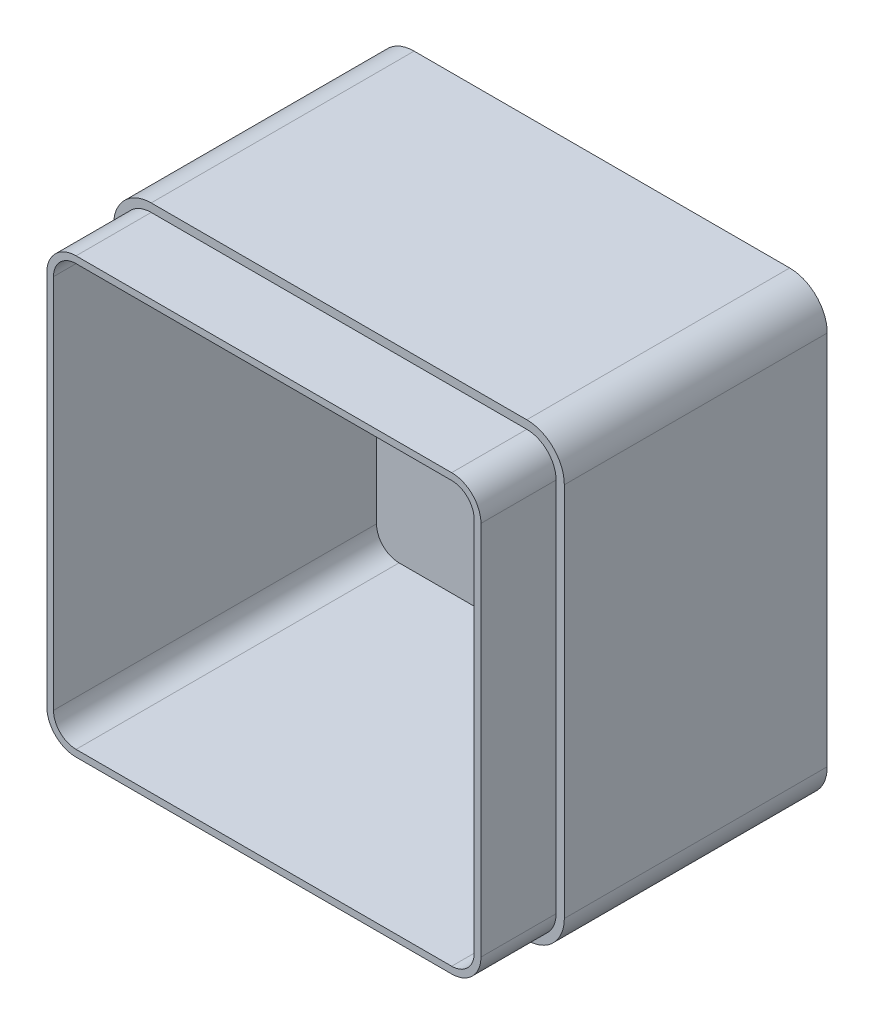
ISO-10303-21;
HEADER;
FILE_DESCRIPTION(('STEP AP214'),'2;1');
FILE_NAME('part.step','',(''),(''),'','','');
FILE_SCHEMA(('AUTOMOTIVE_DESIGN { 1 0 10303 214 1 1 1 1 }'));
ENDSEC;
DATA;
#1=APPLICATION_CONTEXT('core data for automotive mechanical design processes');
#2=APPLICATION_PROTOCOL_DEFINITION('international standard','automotive_design',2000,#1);
#3=PRODUCT_CONTEXT('',#1,'mechanical');
#4=PRODUCT('Part','Part','',(#3));
#5=PRODUCT_RELATED_PRODUCT_CATEGORY('part','',(#4));
#6=PRODUCT_DEFINITION_FORMATION('','',#4);
#7=PRODUCT_DEFINITION_CONTEXT('part definition',#1,'design');
#8=PRODUCT_DEFINITION('design','',#6,#7);
#9=PRODUCT_DEFINITION_SHAPE('','',#8);
#10=(LENGTH_UNIT() NAMED_UNIT(*) SI_UNIT(.MILLI.,.METRE.));
#11=(NAMED_UNIT(*) PLANE_ANGLE_UNIT() SI_UNIT($,.RADIAN.));
#12=(NAMED_UNIT(*) SI_UNIT($,.STERADIAN.) SOLID_ANGLE_UNIT());
#13=UNCERTAINTY_MEASURE_WITH_UNIT(LENGTH_MEASURE(1.E-05),#10,'distance_accuracy_value','');
#14=(GEOMETRIC_REPRESENTATION_CONTEXT(3) GLOBAL_UNCERTAINTY_ASSIGNED_CONTEXT((#13)) GLOBAL_UNIT_ASSIGNED_CONTEXT((#10,
#11,#12)) REPRESENTATION_CONTEXT('',''));
#15=CARTESIAN_POINT('',(0.,0.,0.));
#16=DIRECTION('',(0.,0.,1.));
#17=DIRECTION('',(1.,0.,0.));
#18=AXIS2_PLACEMENT_3D('',#15,#16,#17);
#19=CARTESIAN_POINT('',(0.,0.,90.));
#20=DIRECTION('',(0.,0.,-1.));
#21=DIRECTION('',(-1.,0.,0.));
#22=AXIS2_PLACEMENT_3D('',#19,#20,#21);
#23=PLANE('',#22);
#24=DIRECTION('',(0.,-1.,0.));
#25=VECTOR('',#24,1.);
#26=CARTESIAN_POINT('',(4.,0.,90.));
#27=LINE('',#26,#25);
#28=CARTESIAN_POINT('',(4.,110.,90.));
#29=VERTEX_POINT('',#28);
#30=CARTESIAN_POINT('',(4.,9.99999999999999,90.));
#31=VERTEX_POINT('',#30);
#32=EDGE_CURVE('E323',#29,#31,#27,.T.);
#33=ORIENTED_EDGE('',*,*,#32,.F.);
#34=CARTESIAN_POINT('',(10.,110.,90.));
#35=DIRECTION('',(0.,0.,-1.));
#36=DIRECTION('',(-1.,0.,0.));
#37=AXIS2_PLACEMENT_3D('',#34,#35,#36);
#38=CIRCLE('',#37,6.);
#39=CARTESIAN_POINT('',(9.99999999999999,116.,90.));
#40=VERTEX_POINT('',#39);
#41=EDGE_CURVE('E306',#40,#29,#38,.F.);
#42=ORIENTED_EDGE('',*,*,#41,.F.);
#43=DIRECTION('',(-1.,0.,0.));
#44=VECTOR('',#43,1.);
#45=CARTESIAN_POINT('',(0.,116.,90.));
#46=LINE('',#45,#44);
#47=CARTESIAN_POINT('',(110.,116.,90.));
#48=VERTEX_POINT('',#47);
#49=EDGE_CURVE('E332',#48,#40,#46,.T.);
#50=ORIENTED_EDGE('',*,*,#49,.F.);
#51=CARTESIAN_POINT('',(110.,110.,90.));
#52=DIRECTION('',(0.,0.,-1.));
#53=DIRECTION('',(-1.,0.,0.));
#54=AXIS2_PLACEMENT_3D('',#51,#52,#53);
#55=CIRCLE('',#54,6.);
#56=CARTESIAN_POINT('',(116.,110.,90.));
#57=VERTEX_POINT('',#56);
#58=EDGE_CURVE('E355',#57,#48,#55,.F.);
#59=ORIENTED_EDGE('',*,*,#58,.F.);
#60=DIRECTION('',(0.,1.,0.));
#61=VECTOR('',#60,1.);
#62=CARTESIAN_POINT('',(116.,0.,90.));
#63=LINE('',#62,#61);
#64=CARTESIAN_POINT('',(116.,9.99999999999999,90.));
#65=VERTEX_POINT('',#64);
#66=EDGE_CURVE('E353',#65,#57,#63,.T.);
#67=ORIENTED_EDGE('',*,*,#66,.F.);
#68=CARTESIAN_POINT('',(110.,10.,90.));
#69=DIRECTION('',(0.,0.,-1.));
#70=DIRECTION('',(-1.,0.,0.));
#71=AXIS2_PLACEMENT_3D('',#68,#69,#70);
#72=CIRCLE('',#71,6.);
#73=CARTESIAN_POINT('',(110.,4.,90.));
#74=VERTEX_POINT('',#73);
#75=EDGE_CURVE('E350',#74,#65,#72,.F.);
#76=ORIENTED_EDGE('',*,*,#75,.F.);
#77=DIRECTION('',(1.,0.,0.));
#78=VECTOR('',#77,1.);
#79=CARTESIAN_POINT('',(0.,4.,90.));
#80=LINE('',#79,#78);
#81=CARTESIAN_POINT('',(9.99999999999999,4.,90.));
#82=VERTEX_POINT('',#81);
#83=EDGE_CURVE('E348',#82,#74,#80,.T.);
#84=ORIENTED_EDGE('',*,*,#83,.F.);
#85=CARTESIAN_POINT('',(10.,10.,90.));
#86=DIRECTION('',(0.,0.,-1.));
#87=DIRECTION('',(-1.,0.,0.));
#88=AXIS2_PLACEMENT_3D('',#85,#86,#87);
#89=CIRCLE('',#88,6.);
#90=EDGE_CURVE('E339',#31,#82,#89,.F.);
#91=ORIENTED_EDGE('',*,*,#90,.F.);
#92=EDGE_LOOP('',(#33,#42,#50,#59,#67,#76,#84,#91));
#93=FACE_BOUND('',#92,.T.);
#94=CARTESIAN_POINT('',(10.,110.,90.));
#95=DIRECTION('',(0.,0.,1.));
#96=DIRECTION('',(1.,0.,0.));
#97=AXIS2_PLACEMENT_3D('',#94,#95,#96);
#98=CIRCLE('',#97,7.79999999999999);
#99=CARTESIAN_POINT('',(9.99999999999999,117.8,90.));
#100=VERTEX_POINT('',#99);
#101=CARTESIAN_POINT('',(2.2,110.,90.));
#102=VERTEX_POINT('',#101);
#103=EDGE_CURVE('E258',#100,#102,#98,.T.);
#104=ORIENTED_EDGE('',*,*,#103,.T.);
#105=DIRECTION('',(0.,-1.,0.));
#106=VECTOR('',#105,1.);
#107=CARTESIAN_POINT('',(2.2,110.,90.));
#108=LINE('',#107,#106);
#109=CARTESIAN_POINT('',(2.20000000000001,9.99999999999999,90.));
#110=VERTEX_POINT('',#109);
#111=EDGE_CURVE('E218',#102,#110,#108,.T.);
#112=ORIENTED_EDGE('',*,*,#111,.T.);
#113=CARTESIAN_POINT('',(10.,10.,90.));
#114=DIRECTION('',(0.,0.,1.));
#115=DIRECTION('',(1.,0.,0.));
#116=AXIS2_PLACEMENT_3D('',#113,#114,#115);
#117=CIRCLE('',#116,7.79999999999999);
#118=CARTESIAN_POINT('',(9.99999999999999,2.20000000000001,90.));
#119=VERTEX_POINT('',#118);
#120=EDGE_CURVE('E67',#110,#119,#117,.T.);
#121=ORIENTED_EDGE('',*,*,#120,.T.);
#122=DIRECTION('',(1.,0.,0.));
#123=VECTOR('',#122,1.);
#124=CARTESIAN_POINT('',(9.99999999999999,2.2,90.));
#125=LINE('',#124,#123);
#126=CARTESIAN_POINT('',(110.,2.2,90.));
#127=VERTEX_POINT('',#126);
#128=EDGE_CURVE('E262',#119,#127,#125,.T.);
#129=ORIENTED_EDGE('',*,*,#128,.T.);
#130=CARTESIAN_POINT('',(110.,10.,90.));
#131=DIRECTION('',(0.,0.,1.));
#132=DIRECTION('',(1.,0.,0.));
#133=AXIS2_PLACEMENT_3D('',#130,#131,#132);
#134=CIRCLE('',#133,7.79999999999999);
#135=CARTESIAN_POINT('',(117.8,10.,90.));
#136=VERTEX_POINT('',#135);
#137=EDGE_CURVE('E265',#127,#136,#134,.T.);
#138=ORIENTED_EDGE('',*,*,#137,.T.);
#139=DIRECTION('',(0.,1.,0.));
#140=VECTOR('',#139,1.);
#141=CARTESIAN_POINT('',(117.8,9.99999999999999,90.));
#142=LINE('',#141,#140);
#143=CARTESIAN_POINT('',(117.8,110.,90.));
#144=VERTEX_POINT('',#143);
#145=EDGE_CURVE('E268',#136,#144,#142,.T.);
#146=ORIENTED_EDGE('',*,*,#145,.T.);
#147=CARTESIAN_POINT('',(110.,110.,90.));
#148=DIRECTION('',(0.,0.,1.));
#149=DIRECTION('',(1.,0.,0.));
#150=AXIS2_PLACEMENT_3D('',#147,#148,#149);
#151=CIRCLE('',#150,7.8);
#152=CARTESIAN_POINT('',(110.,117.8,90.));
#153=VERTEX_POINT('',#152);
#154=EDGE_CURVE('E241',#144,#153,#151,.T.);
#155=ORIENTED_EDGE('',*,*,#154,.T.);
#156=DIRECTION('',(-1.,0.,0.));
#157=VECTOR('',#156,1.);
#158=CARTESIAN_POINT('',(110.,117.8,90.));
#159=LINE('',#158,#157);
#160=EDGE_CURVE('E238',#153,#100,#159,.T.);
#161=ORIENTED_EDGE('',*,*,#160,.T.);
#162=EDGE_LOOP('',(#104,#112,#121,#129,#138,#146,#155,#161));
#163=FACE_BOUND('',#162,.T.);
#164=ADVANCED_FACE('F52',(#93,#163),#23,.F.);
#165=CARTESIAN_POINT('',(4.,0.,90.));
#166=DIRECTION('',(1.,0.,0.));
#167=DIRECTION('',(0.,0.,-1.));
#168=AXIS2_PLACEMENT_3D('',#165,#166,#167);
#169=PLANE('',#168);
#170=DIRECTION('',(0.,-1.,0.));
#171=VECTOR('',#170,1.);
#172=CARTESIAN_POINT('',(4.,0.,4.));
#173=LINE('',#172,#171);
#174=CARTESIAN_POINT('',(4.,110.,4.));
#175=VERTEX_POINT('',#174);
#176=CARTESIAN_POINT('',(4.,9.99999999999999,4.));
#177=VERTEX_POINT('',#176);
#178=EDGE_CURVE('E300',#175,#177,#173,.T.);
#179=ORIENTED_EDGE('',*,*,#178,.F.);
#180=DIRECTION('',(0.,0.,-1.));
#181=VECTOR('',#180,1.);
#182=CARTESIAN_POINT('',(4.,110.,90.));
#183=LINE('',#182,#181);
#184=EDGE_CURVE('E307',#29,#175,#183,.T.);
#185=ORIENTED_EDGE('',*,*,#184,.F.);
#186=ORIENTED_EDGE('',*,*,#32,.T.);
#187=DIRECTION('',(0.,0.,-1.));
#188=VECTOR('',#187,1.);
#189=CARTESIAN_POINT('',(4.,9.99999999999999,90.));
#190=LINE('',#189,#188);
#191=EDGE_CURVE('E304',#177,#31,#190,.F.);
#192=ORIENTED_EDGE('',*,*,#191,.F.);
#193=EDGE_LOOP('',(#179,#185,#186,#192));
#194=FACE_BOUND('',#193,.T.);
#195=ADVANCED_FACE('F446',(#194),#169,.T.);
#196=CARTESIAN_POINT('',(0.,4.,90.));
#197=DIRECTION('',(0.,1.,0.));
#198=DIRECTION('',(0.,0.,1.));
#199=AXIS2_PLACEMENT_3D('',#196,#197,#198);
#200=PLANE('',#199);
#201=ORIENTED_EDGE('',*,*,#83,.T.);
#202=DIRECTION('',(0.,0.,1.));
#203=VECTOR('',#202,1.);
#204=CARTESIAN_POINT('',(110.,4.,90.));
#205=LINE('',#204,#203);
#206=CARTESIAN_POINT('',(110.,4.,4.));
#207=VERTEX_POINT('',#206);
#208=EDGE_CURVE('E330',#207,#74,#205,.T.);
#209=ORIENTED_EDGE('',*,*,#208,.F.);
#210=DIRECTION('',(1.,0.,0.));
#211=VECTOR('',#210,1.);
#212=CARTESIAN_POINT('',(0.,4.,4.));
#213=LINE('',#212,#211);
#214=CARTESIAN_POINT('',(9.99999999999999,4.,4.));
#215=VERTEX_POINT('',#214);
#216=EDGE_CURVE('E303',#215,#207,#213,.T.);
#217=ORIENTED_EDGE('',*,*,#216,.F.);
#218=DIRECTION('',(0.,0.,1.));
#219=VECTOR('',#218,1.);
#220=CARTESIAN_POINT('',(9.99999999999999,4.,90.));
#221=LINE('',#220,#219);
#222=EDGE_CURVE('E319',#82,#215,#221,.F.);
#223=ORIENTED_EDGE('',*,*,#222,.F.);
#224=EDGE_LOOP('',(#201,#209,#217,#223));
#225=FACE_BOUND('',#224,.T.);
#226=ADVANCED_FACE('F452',(#225),#200,.T.);
#227=CARTESIAN_POINT('',(116.,0.,90.));
#228=DIRECTION('',(-1.,0.,0.));
#229=DIRECTION('',(0.,0.,1.));
#230=AXIS2_PLACEMENT_3D('',#227,#228,#229);
#231=PLANE('',#230);
#232=ORIENTED_EDGE('',*,*,#66,.T.);
#233=DIRECTION('',(0.,0.,1.));
#234=VECTOR('',#233,1.);
#235=CARTESIAN_POINT('',(116.,110.,90.));
#236=LINE('',#235,#234);
#237=CARTESIAN_POINT('',(116.,110.,4.));
#238=VERTEX_POINT('',#237);
#239=EDGE_CURVE('E337',#238,#57,#236,.T.);
#240=ORIENTED_EDGE('',*,*,#239,.F.);
#241=DIRECTION('',(0.,1.,0.));
#242=VECTOR('',#241,1.);
#243=CARTESIAN_POINT('',(116.,0.,4.));
#244=LINE('',#243,#242);
#245=CARTESIAN_POINT('',(116.,9.99999999999999,4.));
#246=VERTEX_POINT('',#245);
#247=EDGE_CURVE('E313',#246,#238,#244,.T.);
#248=ORIENTED_EDGE('',*,*,#247,.F.);
#249=DIRECTION('',(0.,0.,1.));
#250=VECTOR('',#249,1.);
#251=CARTESIAN_POINT('',(116.,9.99999999999999,90.));
#252=LINE('',#251,#250);
#253=EDGE_CURVE('E333',#65,#246,#252,.F.);
#254=ORIENTED_EDGE('',*,*,#253,.F.);
#255=EDGE_LOOP('',(#232,#240,#248,#254));
#256=FACE_BOUND('',#255,.T.);
#257=ADVANCED_FACE('F480',(#256),#231,.T.);
#258=CARTESIAN_POINT('',(0.,116.,90.));
#259=DIRECTION('',(0.,-1.,0.));
#260=DIRECTION('',(0.,0.,-1.));
#261=AXIS2_PLACEMENT_3D('',#258,#259,#260);
#262=PLANE('',#261);
#263=ORIENTED_EDGE('',*,*,#49,.T.);
#264=DIRECTION('',(0.,0.,-1.));
#265=VECTOR('',#264,1.);
#266=CARTESIAN_POINT('',(9.99999999999999,116.,90.));
#267=LINE('',#266,#265);
#268=CARTESIAN_POINT('',(9.99999999999999,116.,4.));
#269=VERTEX_POINT('',#268);
#270=EDGE_CURVE('E336',#269,#40,#267,.F.);
#271=ORIENTED_EDGE('',*,*,#270,.F.);
#272=DIRECTION('',(-1.,0.,0.));
#273=VECTOR('',#272,1.);
#274=CARTESIAN_POINT('',(0.,116.,4.));
#275=LINE('',#274,#273);
#276=CARTESIAN_POINT('',(110.,116.,4.));
#277=VERTEX_POINT('',#276);
#278=EDGE_CURVE('E320',#277,#269,#275,.T.);
#279=ORIENTED_EDGE('',*,*,#278,.F.);
#280=DIRECTION('',(0.,0.,-1.));
#281=VECTOR('',#280,1.);
#282=CARTESIAN_POINT('',(110.,116.,90.));
#283=LINE('',#282,#281);
#284=EDGE_CURVE('E340',#48,#277,#283,.T.);
#285=ORIENTED_EDGE('',*,*,#284,.F.);
#286=EDGE_LOOP('',(#263,#271,#279,#285));
#287=FACE_BOUND('',#286,.T.);
#288=ADVANCED_FACE('F476',(#287),#262,.T.);
#289=CARTESIAN_POINT('',(0.,0.,4.));
#290=DIRECTION('',(0.,0.,-1.));
#291=DIRECTION('',(-1.,0.,0.));
#292=AXIS2_PLACEMENT_3D('',#289,#290,#291);
#293=PLANE('',#292);
#294=ORIENTED_EDGE('',*,*,#216,.T.);
#295=CARTESIAN_POINT('',(110.,10.,4.));
#296=DIRECTION('',(0.,0.,-1.));
#297=DIRECTION('',(-1.,0.,0.));
#298=AXIS2_PLACEMENT_3D('',#295,#296,#297);
#299=CIRCLE('',#298,6.);
#300=EDGE_CURVE('E315',#246,#207,#299,.T.);
#301=ORIENTED_EDGE('',*,*,#300,.F.);
#302=ORIENTED_EDGE('',*,*,#247,.T.);
#303=CARTESIAN_POINT('',(110.,110.,4.));
#304=DIRECTION('',(0.,0.,-1.));
#305=DIRECTION('',(-1.,0.,0.));
#306=AXIS2_PLACEMENT_3D('',#303,#304,#305);
#307=CIRCLE('',#306,6.);
#308=EDGE_CURVE('E318',#277,#238,#307,.T.);
#309=ORIENTED_EDGE('',*,*,#308,.F.);
#310=ORIENTED_EDGE('',*,*,#278,.T.);
#311=CARTESIAN_POINT('',(10.,110.,4.));
#312=DIRECTION('',(0.,0.,-1.));
#313=DIRECTION('',(-1.,0.,0.));
#314=AXIS2_PLACEMENT_3D('',#311,#312,#313);
#315=CIRCLE('',#314,6.);
#316=EDGE_CURVE('E316',#175,#269,#315,.T.);
#317=ORIENTED_EDGE('',*,*,#316,.F.);
#318=ORIENTED_EDGE('',*,*,#178,.T.);
#319=CARTESIAN_POINT('',(10.,10.,4.));
#320=DIRECTION('',(0.,0.,-1.));
#321=DIRECTION('',(-1.,0.,0.));
#322=AXIS2_PLACEMENT_3D('',#319,#320,#321);
#323=CIRCLE('',#322,6.);
#324=EDGE_CURVE('E310',#215,#177,#323,.T.);
#325=ORIENTED_EDGE('',*,*,#324,.F.);
#326=EDGE_LOOP('',(#294,#301,#302,#309,#310,#317,#318,#325));
#327=FACE_BOUND('',#326,.T.);
#328=ADVANCED_FACE('F472',(#327),#293,.F.);
#329=CARTESIAN_POINT('',(10.,10.,90.));
#330=DIRECTION('',(0.,0.,-1.));
#331=DIRECTION('',(-1.,0.,0.));
#332=AXIS2_PLACEMENT_3D('',#329,#330,#331);
#333=CYLINDRICAL_SURFACE('',#332,6.);
#334=ORIENTED_EDGE('',*,*,#90,.T.);
#335=ORIENTED_EDGE('',*,*,#222,.T.);
#336=ORIENTED_EDGE('',*,*,#324,.T.);
#337=ORIENTED_EDGE('',*,*,#191,.T.);
#338=EDGE_LOOP('',(#334,#335,#336,#337));
#339=FACE_BOUND('',#338,.T.);
#340=ADVANCED_FACE('F468',(#339),#333,.F.);
#341=CARTESIAN_POINT('',(110.,10.,90.));
#342=DIRECTION('',(0.,0.,-1.));
#343=DIRECTION('',(-1.,0.,0.));
#344=AXIS2_PLACEMENT_3D('',#341,#342,#343);
#345=CYLINDRICAL_SURFACE('',#344,6.);
#346=ORIENTED_EDGE('',*,*,#75,.T.);
#347=ORIENTED_EDGE('',*,*,#253,.T.);
#348=ORIENTED_EDGE('',*,*,#300,.T.);
#349=ORIENTED_EDGE('',*,*,#208,.T.);
#350=EDGE_LOOP('',(#346,#347,#348,#349));
#351=FACE_BOUND('',#350,.T.);
#352=ADVANCED_FACE('F464',(#351),#345,.F.);
#353=CARTESIAN_POINT('',(110.,110.,90.));
#354=DIRECTION('',(0.,0.,-1.));
#355=DIRECTION('',(-1.,0.,0.));
#356=AXIS2_PLACEMENT_3D('',#353,#354,#355);
#357=CYLINDRICAL_SURFACE('',#356,6.);
#358=ORIENTED_EDGE('',*,*,#58,.T.);
#359=ORIENTED_EDGE('',*,*,#284,.T.);
#360=ORIENTED_EDGE('',*,*,#308,.T.);
#361=ORIENTED_EDGE('',*,*,#239,.T.);
#362=EDGE_LOOP('',(#358,#359,#360,#361));
#363=FACE_BOUND('',#362,.T.);
#364=ADVANCED_FACE('F460',(#363),#357,.F.);
#365=CARTESIAN_POINT('',(10.,110.,90.));
#366=DIRECTION('',(0.,0.,-1.));
#367=DIRECTION('',(-1.,0.,0.));
#368=AXIS2_PLACEMENT_3D('',#365,#366,#367);
#369=CYLINDRICAL_SURFACE('',#368,6.);
#370=ORIENTED_EDGE('',*,*,#41,.T.);
#371=ORIENTED_EDGE('',*,*,#184,.T.);
#372=ORIENTED_EDGE('',*,*,#316,.T.);
#373=ORIENTED_EDGE('',*,*,#270,.T.);
#374=EDGE_LOOP('',(#370,#371,#372,#373));
#375=FACE_BOUND('',#374,.T.);
#376=ADVANCED_FACE('F458',(#375),#369,.F.);
#377=CARTESIAN_POINT('',(10.,110.,70.));
#378=DIRECTION('',(0.,0.,1.));
#379=DIRECTION('',(1.,0.,0.));
#380=AXIS2_PLACEMENT_3D('',#377,#378,#379);
#381=PLANE('',#380);
#382=DIRECTION('',(-1.,0.,0.));
#383=VECTOR('',#382,1.);
#384=CARTESIAN_POINT('',(110.,117.8,70.));
#385=LINE('',#384,#383);
#386=CARTESIAN_POINT('',(110.,117.8,70.));
#387=VERTEX_POINT('',#386);
#388=CARTESIAN_POINT('',(9.99999999999999,117.8,70.));
#389=VERTEX_POINT('',#388);
#390=EDGE_CURVE('E224',#387,#389,#385,.T.);
#391=ORIENTED_EDGE('',*,*,#390,.F.);
#392=CARTESIAN_POINT('',(110.,110.,70.));
#393=DIRECTION('',(0.,0.,1.));
#394=DIRECTION('',(1.,0.,0.));
#395=AXIS2_PLACEMENT_3D('',#392,#393,#394);
#396=CIRCLE('',#395,7.8);
#397=CARTESIAN_POINT('',(117.8,110.,70.));
#398=VERTEX_POINT('',#397);
#399=EDGE_CURVE('E254',#398,#387,#396,.T.);
#400=ORIENTED_EDGE('',*,*,#399,.F.);
#401=DIRECTION('',(0.,1.,0.));
#402=VECTOR('',#401,1.);
#403=CARTESIAN_POINT('',(117.8,9.99999999999999,70.));
#404=LINE('',#403,#402);
#405=CARTESIAN_POINT('',(117.8,10.,70.));
#406=VERTEX_POINT('',#405);
#407=EDGE_CURVE('E251',#406,#398,#404,.T.);
#408=ORIENTED_EDGE('',*,*,#407,.F.);
#409=CARTESIAN_POINT('',(110.,10.,70.));
#410=DIRECTION('',(0.,0.,1.));
#411=DIRECTION('',(1.,0.,0.));
#412=AXIS2_PLACEMENT_3D('',#409,#410,#411);
#413=CIRCLE('',#412,7.79999999999999);
#414=CARTESIAN_POINT('',(110.,2.2,70.));
#415=VERTEX_POINT('',#414);
#416=EDGE_CURVE('E248',#415,#406,#413,.T.);
#417=ORIENTED_EDGE('',*,*,#416,.F.);
#418=DIRECTION('',(1.,0.,0.));
#419=VECTOR('',#418,1.);
#420=CARTESIAN_POINT('',(9.99999999999999,2.2,70.));
#421=LINE('',#420,#419);
#422=CARTESIAN_POINT('',(9.99999999999999,2.20000000000001,70.));
#423=VERTEX_POINT('',#422);
#424=EDGE_CURVE('E245',#423,#415,#421,.T.);
#425=ORIENTED_EDGE('',*,*,#424,.F.);
#426=CARTESIAN_POINT('',(10.,10.,70.));
#427=DIRECTION('',(0.,0.,1.));
#428=DIRECTION('',(1.,0.,0.));
#429=AXIS2_PLACEMENT_3D('',#426,#427,#428);
#430=CIRCLE('',#429,7.79999999999999);
#431=CARTESIAN_POINT('',(2.20000000000001,9.99999999999999,70.));
#432=VERTEX_POINT('',#431);
#433=EDGE_CURVE('E234',#432,#423,#430,.T.);
#434=ORIENTED_EDGE('',*,*,#433,.F.);
#435=DIRECTION('',(0.,-1.,0.));
#436=VECTOR('',#435,1.);
#437=CARTESIAN_POINT('',(2.2,110.,70.));
#438=LINE('',#437,#436);
#439=CARTESIAN_POINT('',(2.2,110.,70.));
#440=VERTEX_POINT('',#439);
#441=EDGE_CURVE('E216',#440,#432,#438,.T.);
#442=ORIENTED_EDGE('',*,*,#441,.F.);
#443=CARTESIAN_POINT('',(10.,110.,70.));
#444=DIRECTION('',(0.,0.,1.));
#445=DIRECTION('',(1.,0.,0.));
#446=AXIS2_PLACEMENT_3D('',#443,#444,#445);
#447=CIRCLE('',#446,7.79999999999999);
#448=EDGE_CURVE('E230',#389,#440,#447,.T.);
#449=ORIENTED_EDGE('',*,*,#448,.F.);
#450=EDGE_LOOP('',(#391,#400,#408,#417,#425,#434,#442,#449));
#451=FACE_BOUND('',#450,.T.);
#452=CARTESIAN_POINT('',(10.,110.,70.));
#453=DIRECTION('',(0.,0.,1.));
#454=DIRECTION('',(1.,0.,0.));
#455=AXIS2_PLACEMENT_3D('',#452,#453,#454);
#456=CIRCLE('',#455,10.);
#457=CARTESIAN_POINT('',(10.,120.,70.));
#458=VERTEX_POINT('',#457);
#459=CARTESIAN_POINT('',(0.,110.,70.));
#460=VERTEX_POINT('',#459);
#461=EDGE_CURVE('E274',#458,#460,#456,.T.);
#462=ORIENTED_EDGE('',*,*,#461,.T.);
#463=DIRECTION('',(0.,-1.,0.));
#464=VECTOR('',#463,1.);
#465=CARTESIAN_POINT('',(0.,110.,70.));
#466=LINE('',#465,#464);
#467=CARTESIAN_POINT('',(0.,9.99999999999999,70.));
#468=VERTEX_POINT('',#467);
#469=EDGE_CURVE('E287',#460,#468,#466,.T.);
#470=ORIENTED_EDGE('',*,*,#469,.T.);
#471=CARTESIAN_POINT('',(10.,10.,70.));
#472=DIRECTION('',(0.,0.,1.));
#473=DIRECTION('',(1.,0.,0.));
#474=AXIS2_PLACEMENT_3D('',#471,#472,#473);
#475=CIRCLE('',#474,10.);
#476=CARTESIAN_POINT('',(9.99999999999999,0.,70.));
#477=VERTEX_POINT('',#476);
#478=EDGE_CURVE('E289',#468,#477,#475,.T.);
#479=ORIENTED_EDGE('',*,*,#478,.T.);
#480=DIRECTION('',(1.,0.,0.));
#481=VECTOR('',#480,1.);
#482=CARTESIAN_POINT('',(9.99999999999999,0.,70.));
#483=LINE('',#482,#481);
#484=CARTESIAN_POINT('',(110.,0.,70.));
#485=VERTEX_POINT('',#484);
#486=EDGE_CURVE('E291',#477,#485,#483,.T.);
#487=ORIENTED_EDGE('',*,*,#486,.T.);
#488=CARTESIAN_POINT('',(110.,10.,70.));
#489=DIRECTION('',(0.,0.,1.));
#490=DIRECTION('',(1.,0.,0.));
#491=AXIS2_PLACEMENT_3D('',#488,#489,#490);
#492=CIRCLE('',#491,9.99999999999999);
#493=CARTESIAN_POINT('',(120.,10.,70.));
#494=VERTEX_POINT('',#493);
#495=EDGE_CURVE('E293',#485,#494,#492,.T.);
#496=ORIENTED_EDGE('',*,*,#495,.T.);
#497=DIRECTION('',(0.,1.,0.));
#498=VECTOR('',#497,1.);
#499=CARTESIAN_POINT('',(120.,10.,70.));
#500=LINE('',#499,#498);
#501=CARTESIAN_POINT('',(120.,110.,70.));
#502=VERTEX_POINT('',#501);
#503=EDGE_CURVE('E295',#494,#502,#500,.T.);
#504=ORIENTED_EDGE('',*,*,#503,.T.);
#505=CARTESIAN_POINT('',(110.,110.,70.));
#506=DIRECTION('',(0.,0.,1.));
#507=DIRECTION('',(1.,0.,0.));
#508=AXIS2_PLACEMENT_3D('',#505,#506,#507);
#509=CIRCLE('',#508,9.99999999999999);
#510=CARTESIAN_POINT('',(110.,120.,70.));
#511=VERTEX_POINT('',#510);
#512=EDGE_CURVE('E297',#502,#511,#509,.T.);
#513=ORIENTED_EDGE('',*,*,#512,.T.);
#514=DIRECTION('',(-1.,0.,0.));
#515=VECTOR('',#514,1.);
#516=CARTESIAN_POINT('',(110.,120.,70.));
#517=LINE('',#516,#515);
#518=EDGE_CURVE('E75',#511,#458,#517,.T.);
#519=ORIENTED_EDGE('',*,*,#518,.T.);
#520=EDGE_LOOP('',(#462,#470,#479,#487,#496,#504,#513,#519));
#521=FACE_BOUND('',#520,.T.);
#522=ADVANCED_FACE('F229',(#451,#521),#381,.T.);
#523=CARTESIAN_POINT('',(10.,110.,70.));
#524=DIRECTION('',(0.,0.,1.));
#525=DIRECTION('',(1.,0.,0.));
#526=AXIS2_PLACEMENT_3D('',#523,#524,#525);
#527=CYLINDRICAL_SURFACE('',#526,7.79999999999999);
#528=ORIENTED_EDGE('',*,*,#103,.F.);
#529=DIRECTION('',(0.,0.,1.));
#530=VECTOR('',#529,1.);
#531=CARTESIAN_POINT('',(9.99999999999999,117.8,70.));
#532=LINE('',#531,#530);
#533=EDGE_CURVE('E237',#389,#100,#532,.T.);
#534=ORIENTED_EDGE('',*,*,#533,.F.);
#535=ORIENTED_EDGE('',*,*,#448,.T.);
#536=DIRECTION('',(0.,0.,1.));
#537=VECTOR('',#536,1.);
#538=CARTESIAN_POINT('',(2.2,110.,70.));
#539=LINE('',#538,#537);
#540=EDGE_CURVE('E213',#440,#102,#539,.T.);
#541=ORIENTED_EDGE('',*,*,#540,.T.);
#542=EDGE_LOOP('',(#528,#534,#535,#541));
#543=FACE_BOUND('',#542,.T.);
#544=ADVANCED_FACE('F236',(#543),#527,.T.);
#545=CARTESIAN_POINT('',(110.,117.8,70.));
#546=DIRECTION('',(0.,1.,0.));
#547=DIRECTION('',(-1.,0.,0.));
#548=AXIS2_PLACEMENT_3D('',#545,#546,#547);
#549=PLANE('',#548);
#550=ORIENTED_EDGE('',*,*,#160,.F.);
#551=DIRECTION('',(0.,0.,1.));
#552=VECTOR('',#551,1.);
#553=CARTESIAN_POINT('',(110.,117.8,70.));
#554=LINE('',#553,#552);
#555=EDGE_CURVE('E275',#387,#153,#554,.T.);
#556=ORIENTED_EDGE('',*,*,#555,.F.);
#557=ORIENTED_EDGE('',*,*,#390,.T.);
#558=ORIENTED_EDGE('',*,*,#533,.T.);
#559=EDGE_LOOP('',(#550,#556,#557,#558));
#560=FACE_BOUND('',#559,.T.);
#561=ADVANCED_FACE('F490',(#560),#549,.T.);
#562=CARTESIAN_POINT('',(110.,110.,70.));
#563=DIRECTION('',(0.,0.,1.));
#564=DIRECTION('',(1.,0.,0.));
#565=AXIS2_PLACEMENT_3D('',#562,#563,#564);
#566=CYLINDRICAL_SURFACE('',#565,7.8);
#567=ORIENTED_EDGE('',*,*,#154,.F.);
#568=DIRECTION('',(0.,0.,1.));
#569=VECTOR('',#568,1.);
#570=CARTESIAN_POINT('',(117.8,110.,70.));
#571=LINE('',#570,#569);
#572=EDGE_CURVE('E277',#398,#144,#571,.T.);
#573=ORIENTED_EDGE('',*,*,#572,.F.);
#574=ORIENTED_EDGE('',*,*,#399,.T.);
#575=ORIENTED_EDGE('',*,*,#555,.T.);
#576=EDGE_LOOP('',(#567,#573,#574,#575));
#577=FACE_BOUND('',#576,.T.);
#578=ADVANCED_FACE('F505',(#577),#566,.T.);
#579=CARTESIAN_POINT('',(117.8,9.99999999999999,70.));
#580=DIRECTION('',(1.,0.,0.));
#581=DIRECTION('',(0.,1.,0.));
#582=AXIS2_PLACEMENT_3D('',#579,#580,#581);
#583=PLANE('',#582);
#584=ORIENTED_EDGE('',*,*,#145,.F.);
#585=DIRECTION('',(0.,0.,1.));
#586=VECTOR('',#585,1.);
#587=CARTESIAN_POINT('',(117.8,10.,70.));
#588=LINE('',#587,#586);
#589=EDGE_CURVE('E279',#406,#136,#588,.T.);
#590=ORIENTED_EDGE('',*,*,#589,.F.);
#591=ORIENTED_EDGE('',*,*,#407,.T.);
#592=ORIENTED_EDGE('',*,*,#572,.T.);
#593=EDGE_LOOP('',(#584,#590,#591,#592));
#594=FACE_BOUND('',#593,.T.);
#595=ADVANCED_FACE('F501',(#594),#583,.T.);
#596=CARTESIAN_POINT('',(110.,10.,70.));
#597=DIRECTION('',(0.,0.,1.));
#598=DIRECTION('',(1.,0.,0.));
#599=AXIS2_PLACEMENT_3D('',#596,#597,#598);
#600=CYLINDRICAL_SURFACE('',#599,7.79999999999999);
#601=ORIENTED_EDGE('',*,*,#137,.F.);
#602=DIRECTION('',(0.,0.,1.));
#603=VECTOR('',#602,1.);
#604=CARTESIAN_POINT('',(110.,2.2,70.));
#605=LINE('',#604,#603);
#606=EDGE_CURVE('E281',#415,#127,#605,.T.);
#607=ORIENTED_EDGE('',*,*,#606,.F.);
#608=ORIENTED_EDGE('',*,*,#416,.T.);
#609=ORIENTED_EDGE('',*,*,#589,.T.);
#610=EDGE_LOOP('',(#601,#607,#608,#609));
#611=FACE_BOUND('',#610,.T.);
#612=ADVANCED_FACE('F497',(#611),#600,.T.);
#613=CARTESIAN_POINT('',(9.99999999999999,2.2,70.));
#614=DIRECTION('',(0.,-1.,0.));
#615=DIRECTION('',(1.,0.,0.));
#616=AXIS2_PLACEMENT_3D('',#613,#614,#615);
#617=PLANE('',#616);
#618=ORIENTED_EDGE('',*,*,#128,.F.);
#619=DIRECTION('',(0.,0.,1.));
#620=VECTOR('',#619,1.);
#621=CARTESIAN_POINT('',(9.99999999999999,2.20000000000001,70.));
#622=LINE('',#621,#620);
#623=EDGE_CURVE('E283',#423,#119,#622,.T.);
#624=ORIENTED_EDGE('',*,*,#623,.F.);
#625=ORIENTED_EDGE('',*,*,#424,.T.);
#626=ORIENTED_EDGE('',*,*,#606,.T.);
#627=EDGE_LOOP('',(#618,#624,#625,#626));
#628=FACE_BOUND('',#627,.T.);
#629=ADVANCED_FACE('F494',(#628),#617,.T.);
#630=CARTESIAN_POINT('',(10.,10.,70.));
#631=DIRECTION('',(0.,0.,1.));
#632=DIRECTION('',(1.,0.,0.));
#633=AXIS2_PLACEMENT_3D('',#630,#631,#632);
#634=CYLINDRICAL_SURFACE('',#633,7.79999999999999);
#635=ORIENTED_EDGE('',*,*,#120,.F.);
#636=DIRECTION('',(0.,0.,1.));
#637=VECTOR('',#636,1.);
#638=CARTESIAN_POINT('',(2.20000000000001,9.99999999999999,70.));
#639=LINE('',#638,#637);
#640=EDGE_CURVE('E223',#432,#110,#639,.T.);
#641=ORIENTED_EDGE('',*,*,#640,.F.);
#642=ORIENTED_EDGE('',*,*,#433,.T.);
#643=ORIENTED_EDGE('',*,*,#623,.T.);
#644=EDGE_LOOP('',(#635,#641,#642,#643));
#645=FACE_BOUND('',#644,.T.);
#646=ADVANCED_FACE('F441',(#645),#634,.T.);
#647=CARTESIAN_POINT('',(2.2,110.,70.));
#648=DIRECTION('',(-1.,0.,0.));
#649=DIRECTION('',(0.,-1.,0.));
#650=AXIS2_PLACEMENT_3D('',#647,#648,#649);
#651=PLANE('',#650);
#652=ORIENTED_EDGE('',*,*,#111,.F.);
#653=ORIENTED_EDGE('',*,*,#540,.F.);
#654=ORIENTED_EDGE('',*,*,#441,.T.);
#655=ORIENTED_EDGE('',*,*,#640,.T.);
#656=EDGE_LOOP('',(#652,#653,#654,#655));
#657=FACE_BOUND('',#656,.T.);
#658=ADVANCED_FACE('F215',(#657),#651,.T.);
#659=CARTESIAN_POINT('',(0.,0.,0.));
#660=DIRECTION('',(0.,0.,-1.));
#661=DIRECTION('',(-1.,0.,0.));
#662=AXIS2_PLACEMENT_3D('',#659,#660,#661);
#663=PLANE('',#662);
#664=DIRECTION('',(1.,0.,0.));
#665=VECTOR('',#664,1.);
#666=CARTESIAN_POINT('',(0.,0.,0.));
#667=LINE('',#666,#665);
#668=CARTESIAN_POINT('',(10.,0.,0.));
#669=VERTEX_POINT('',#668);
#670=CARTESIAN_POINT('',(110.,0.,0.));
#671=VERTEX_POINT('',#670);
#672=EDGE_CURVE('E363',#669,#671,#667,.T.);
#673=ORIENTED_EDGE('',*,*,#672,.F.);
#674=CARTESIAN_POINT('',(10.,10.,0.));
#675=DIRECTION('',(0.,0.,-1.));
#676=DIRECTION('',(-1.,0.,0.));
#677=AXIS2_PLACEMENT_3D('',#674,#675,#676);
#678=CIRCLE('',#677,10.);
#679=CARTESIAN_POINT('',(0.,9.99999999999999,0.));
#680=VERTEX_POINT('',#679);
#681=EDGE_CURVE('E383',#669,#680,#678,.T.);
#682=ORIENTED_EDGE('',*,*,#681,.T.);
#683=DIRECTION('',(0.,-1.,0.));
#684=VECTOR('',#683,1.);
#685=CARTESIAN_POINT('',(0.,0.,0.));
#686=LINE('',#685,#684);
#687=CARTESIAN_POINT('',(0.,110.,0.));
#688=VERTEX_POINT('',#687);
#689=EDGE_CURVE('E343',#688,#680,#686,.T.);
#690=ORIENTED_EDGE('',*,*,#689,.F.);
#691=CARTESIAN_POINT('',(10.,110.,0.));
#692=DIRECTION('',(0.,0.,-1.));
#693=DIRECTION('',(-1.,0.,0.));
#694=AXIS2_PLACEMENT_3D('',#691,#692,#693);
#695=CIRCLE('',#694,10.);
#696=CARTESIAN_POINT('',(10.,120.,0.));
#697=VERTEX_POINT('',#696);
#698=EDGE_CURVE('E377',#688,#697,#695,.T.);
#699=ORIENTED_EDGE('',*,*,#698,.T.);
#700=DIRECTION('',(-1.,0.,0.));
#701=VECTOR('',#700,1.);
#702=CARTESIAN_POINT('',(0.,120.,0.));
#703=LINE('',#702,#701);
#704=CARTESIAN_POINT('',(110.,120.,0.));
#705=VERTEX_POINT('',#704);
#706=EDGE_CURVE('E369',#705,#697,#703,.T.);
#707=ORIENTED_EDGE('',*,*,#706,.F.);
#708=CARTESIAN_POINT('',(110.,110.,0.));
#709=DIRECTION('',(0.,0.,-1.));
#710=DIRECTION('',(-1.,0.,0.));
#711=AXIS2_PLACEMENT_3D('',#708,#709,#710);
#712=CIRCLE('',#711,10.);
#713=CARTESIAN_POINT('',(120.,110.,0.));
#714=VERTEX_POINT('',#713);
#715=EDGE_CURVE('E379',#705,#714,#712,.T.);
#716=ORIENTED_EDGE('',*,*,#715,.T.);
#717=DIRECTION('',(0.,1.,0.));
#718=VECTOR('',#717,1.);
#719=CARTESIAN_POINT('',(120.,0.,0.));
#720=LINE('',#719,#718);
#721=CARTESIAN_POINT('',(120.,9.99999999999999,0.));
#722=VERTEX_POINT('',#721);
#723=EDGE_CURVE('E366',#722,#714,#720,.T.);
#724=ORIENTED_EDGE('',*,*,#723,.F.);
#725=CARTESIAN_POINT('',(110.,10.,0.));
#726=DIRECTION('',(0.,0.,-1.));
#727=DIRECTION('',(-1.,0.,0.));
#728=AXIS2_PLACEMENT_3D('',#725,#726,#727);
#729=CIRCLE('',#728,10.);
#730=EDGE_CURVE('E381',#722,#671,#729,.T.);
#731=ORIENTED_EDGE('',*,*,#730,.T.);
#732=EDGE_LOOP('',(#673,#682,#690,#699,#707,#716,#724,#731));
#733=FACE_BOUND('',#732,.T.);
#734=ADVANCED_FACE('F433',(#733),#663,.T.);
#735=CARTESIAN_POINT('',(10.,110.,90.));
#736=DIRECTION('',(0.,0.,-1.));
#737=DIRECTION('',(-1.,0.,0.));
#738=AXIS2_PLACEMENT_3D('',#735,#736,#737);
#739=CYLINDRICAL_SURFACE('',#738,10.);
#740=DIRECTION('',(0.,0.,-1.));
#741=VECTOR('',#740,1.);
#742=CARTESIAN_POINT('',(0.,110.,90.));
#743=LINE('',#742,#741);
#744=EDGE_CURVE('E385',#460,#688,#743,.T.);
#745=ORIENTED_EDGE('',*,*,#744,.F.);
#746=ORIENTED_EDGE('',*,*,#461,.F.);
#747=DIRECTION('',(0.,0.,-1.));
#748=VECTOR('',#747,1.);
#749=CARTESIAN_POINT('',(10.,120.,90.));
#750=LINE('',#749,#748);
#751=EDGE_CURVE('E60',#697,#458,#750,.F.);
#752=ORIENTED_EDGE('',*,*,#751,.F.);
#753=ORIENTED_EDGE('',*,*,#698,.F.);
#754=EDGE_LOOP('',(#745,#746,#752,#753));
#755=FACE_BOUND('',#754,.T.);
#756=ADVANCED_FACE('F54',(#755),#739,.T.);
#757=CARTESIAN_POINT('',(110.,110.,90.));
#758=DIRECTION('',(0.,0.,-1.));
#759=DIRECTION('',(-1.,0.,0.));
#760=AXIS2_PLACEMENT_3D('',#757,#758,#759);
#761=CYLINDRICAL_SURFACE('',#760,10.);
#762=DIRECTION('',(0.,0.,-1.));
#763=VECTOR('',#762,1.);
#764=CARTESIAN_POINT('',(110.,120.,90.));
#765=LINE('',#764,#763);
#766=EDGE_CURVE('E12',#511,#705,#765,.T.);
#767=ORIENTED_EDGE('',*,*,#766,.F.);
#768=ORIENTED_EDGE('',*,*,#512,.F.);
#769=DIRECTION('',(0.,0.,-1.));
#770=VECTOR('',#769,1.);
#771=CARTESIAN_POINT('',(120.,110.,90.));
#772=LINE('',#771,#770);
#773=EDGE_CURVE('E390',#714,#502,#772,.F.);
#774=ORIENTED_EDGE('',*,*,#773,.F.);
#775=ORIENTED_EDGE('',*,*,#715,.F.);
#776=EDGE_LOOP('',(#767,#768,#774,#775));
#777=FACE_BOUND('',#776,.T.);
#778=ADVANCED_FACE('F431',(#777),#761,.T.);
#779=CARTESIAN_POINT('',(0.,120.,90.));
#780=DIRECTION('',(0.,-1.,0.));
#781=DIRECTION('',(0.,0.,-1.));
#782=AXIS2_PLACEMENT_3D('',#779,#780,#781);
#783=PLANE('',#782);
#784=ORIENTED_EDGE('',*,*,#518,.F.);
#785=ORIENTED_EDGE('',*,*,#766,.T.);
#786=ORIENTED_EDGE('',*,*,#706,.T.);
#787=ORIENTED_EDGE('',*,*,#751,.T.);
#788=EDGE_LOOP('',(#784,#785,#786,#787));
#789=FACE_BOUND('',#788,.T.);
#790=ADVANCED_FACE('F397',(#789),#783,.F.);
#791=CARTESIAN_POINT('',(110.,10.,90.));
#792=DIRECTION('',(0.,0.,-1.));
#793=DIRECTION('',(-1.,0.,0.));
#794=AXIS2_PLACEMENT_3D('',#791,#792,#793);
#795=CYLINDRICAL_SURFACE('',#794,10.);
#796=DIRECTION('',(0.,0.,-1.));
#797=VECTOR('',#796,1.);
#798=CARTESIAN_POINT('',(120.,10.,90.));
#799=LINE('',#798,#797);
#800=EDGE_CURVE('E393',#494,#722,#799,.T.);
#801=ORIENTED_EDGE('',*,*,#800,.F.);
#802=ORIENTED_EDGE('',*,*,#495,.F.);
#803=DIRECTION('',(0.,0.,-1.));
#804=VECTOR('',#803,1.);
#805=CARTESIAN_POINT('',(110.,0.,90.));
#806=LINE('',#805,#804);
#807=EDGE_CURVE('E372',#671,#485,#806,.F.);
#808=ORIENTED_EDGE('',*,*,#807,.F.);
#809=ORIENTED_EDGE('',*,*,#730,.F.);
#810=EDGE_LOOP('',(#801,#802,#808,#809));
#811=FACE_BOUND('',#810,.T.);
#812=ADVANCED_FACE('F422',(#811),#795,.T.);
#813=CARTESIAN_POINT('',(120.,0.,90.));
#814=DIRECTION('',(-1.,0.,0.));
#815=DIRECTION('',(0.,0.,1.));
#816=AXIS2_PLACEMENT_3D('',#813,#814,#815);
#817=PLANE('',#816);
#818=ORIENTED_EDGE('',*,*,#503,.F.);
#819=ORIENTED_EDGE('',*,*,#800,.T.);
#820=ORIENTED_EDGE('',*,*,#723,.T.);
#821=ORIENTED_EDGE('',*,*,#773,.T.);
#822=EDGE_LOOP('',(#818,#819,#820,#821));
#823=FACE_BOUND('',#822,.T.);
#824=ADVANCED_FACE('F427',(#823),#817,.F.);
#825=CARTESIAN_POINT('',(10.,10.,90.));
#826=DIRECTION('',(0.,0.,-1.));
#827=DIRECTION('',(-1.,0.,0.));
#828=AXIS2_PLACEMENT_3D('',#825,#826,#827);
#829=CYLINDRICAL_SURFACE('',#828,10.);
#830=DIRECTION('',(0.,0.,-1.));
#831=VECTOR('',#830,1.);
#832=CARTESIAN_POINT('',(10.,0.,90.));
#833=LINE('',#832,#831);
#834=EDGE_CURVE('E375',#477,#669,#833,.T.);
#835=ORIENTED_EDGE('',*,*,#834,.F.);
#836=ORIENTED_EDGE('',*,*,#478,.F.);
#837=DIRECTION('',(0.,0.,-1.));
#838=VECTOR('',#837,1.);
#839=CARTESIAN_POINT('',(0.,10.,90.));
#840=LINE('',#839,#838);
#841=EDGE_CURVE('E387',#680,#468,#840,.F.);
#842=ORIENTED_EDGE('',*,*,#841,.F.);
#843=ORIENTED_EDGE('',*,*,#681,.F.);
#844=EDGE_LOOP('',(#835,#836,#842,#843));
#845=FACE_BOUND('',#844,.T.);
#846=ADVANCED_FACE('F412',(#845),#829,.T.);
#847=CARTESIAN_POINT('',(0.,0.,90.));
#848=DIRECTION('',(0.,1.,0.));
#849=DIRECTION('',(0.,0.,1.));
#850=AXIS2_PLACEMENT_3D('',#847,#848,#849);
#851=PLANE('',#850);
#852=ORIENTED_EDGE('',*,*,#486,.F.);
#853=ORIENTED_EDGE('',*,*,#834,.T.);
#854=ORIENTED_EDGE('',*,*,#672,.T.);
#855=ORIENTED_EDGE('',*,*,#807,.T.);
#856=EDGE_LOOP('',(#852,#853,#854,#855));
#857=FACE_BOUND('',#856,.T.);
#858=ADVANCED_FACE('F417',(#857),#851,.F.);
#859=CARTESIAN_POINT('',(0.,0.,90.));
#860=DIRECTION('',(1.,0.,0.));
#861=DIRECTION('',(0.,0.,-1.));
#862=AXIS2_PLACEMENT_3D('',#859,#860,#861);
#863=PLANE('',#862);
#864=ORIENTED_EDGE('',*,*,#469,.F.);
#865=ORIENTED_EDGE('',*,*,#744,.T.);
#866=ORIENTED_EDGE('',*,*,#689,.T.);
#867=ORIENTED_EDGE('',*,*,#841,.T.);
#868=EDGE_LOOP('',(#864,#865,#866,#867));
#869=FACE_BOUND('',#868,.T.);
#870=ADVANCED_FACE('F407',(#869),#863,.F.);
#871=CLOSED_SHELL('',(#164,#195,#226,#257,#288,#328,#340,#352,#364,#376,#522,#544,#561,#578,
#595,#612,#629,#646,#658,#734,#756,#778,#790,#812,#824,#846,#858,#870));
#872=MANIFOLD_SOLID_BREP('B2',#871);
#873=ADVANCED_BREP_SHAPE_REPRESENTATION('',(#18,#872),#14);
#874=SHAPE_DEFINITION_REPRESENTATION(#9,#873);
ENDSEC;
END-ISO-10303-21;
